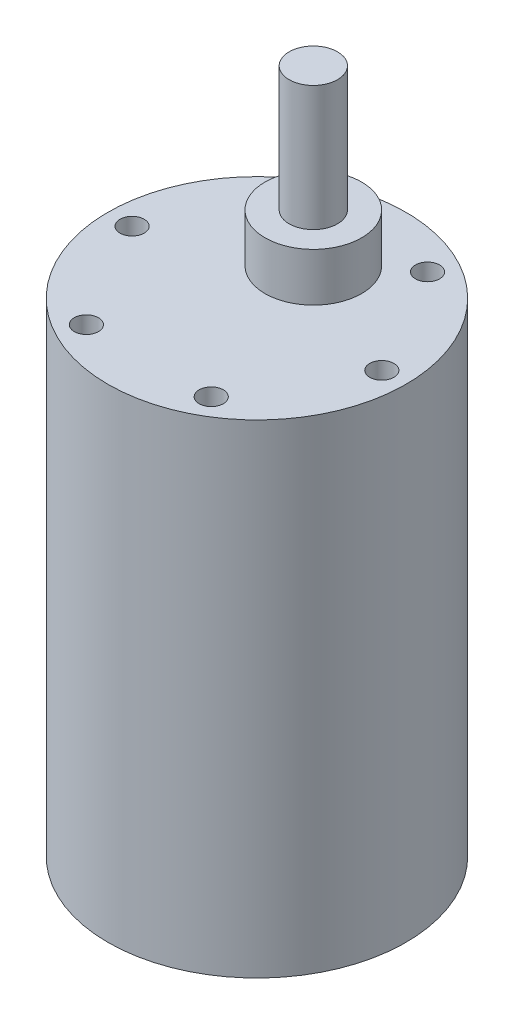
ISO-10303-21;
HEADER;
FILE_DESCRIPTION(('STEP AP214'),'2;1');
FILE_NAME('part.step','',(''),(''),'','','');
FILE_SCHEMA(('AUTOMOTIVE_DESIGN { 1 0 10303 214 1 1 1 1 }'));
ENDSEC;
DATA;
#1=APPLICATION_CONTEXT('core data for automotive mechanical design processes');
#2=APPLICATION_PROTOCOL_DEFINITION('international standard','automotive_design',2000,#1);
#3=PRODUCT_CONTEXT('',#1,'mechanical');
#4=PRODUCT('Part','Part','',(#3));
#5=PRODUCT_RELATED_PRODUCT_CATEGORY('part','',(#4));
#6=PRODUCT_DEFINITION_FORMATION('','',#4);
#7=PRODUCT_DEFINITION_CONTEXT('part definition',#1,'design');
#8=PRODUCT_DEFINITION('design','',#6,#7);
#9=PRODUCT_DEFINITION_SHAPE('','',#8);
#10=(LENGTH_UNIT() NAMED_UNIT(*) SI_UNIT(.MILLI.,.METRE.));
#11=(NAMED_UNIT(*) PLANE_ANGLE_UNIT() SI_UNIT($,.RADIAN.));
#12=(NAMED_UNIT(*) SI_UNIT($,.STERADIAN.) SOLID_ANGLE_UNIT());
#13=UNCERTAINTY_MEASURE_WITH_UNIT(LENGTH_MEASURE(1.E-05),#10,'distance_accuracy_value','');
#14=(GEOMETRIC_REPRESENTATION_CONTEXT(3) GLOBAL_UNCERTAINTY_ASSIGNED_CONTEXT((#13)) GLOBAL_UNIT_ASSIGNED_CONTEXT((#10,
#11,#12)) REPRESENTATION_CONTEXT('',''));
#15=CARTESIAN_POINT('',(0.,0.,0.));
#16=DIRECTION('',(0.,0.,1.));
#17=DIRECTION('',(1.,0.,0.));
#18=AXIS2_PLACEMENT_3D('',#15,#16,#17);
#19=CARTESIAN_POINT('',(0.,66.,-7.));
#20=DIRECTION('',(0.,1.,0.));
#21=DIRECTION('',(0.,0.,1.));
#22=AXIS2_PLACEMENT_3D('',#19,#20,#21);
#23=PLANE('',#22);
#24=CARTESIAN_POINT('',(0.,66.,-7.));
#25=DIRECTION('',(0.,1.,0.));
#26=DIRECTION('',(0.,0.,1.));
#27=AXIS2_PLACEMENT_3D('',#24,#25,#26);
#28=CIRCLE('',#27,6.);
#29=CARTESIAN_POINT('',(0.,66.,-0.999999999999999));
#30=VERTEX_POINT('',#29);
#31=EDGE_CURVE('E44',#30,#30,#28,.T.);
#32=ORIENTED_EDGE('',*,*,#31,.T.);
#33=EDGE_LOOP('',(#32));
#34=FACE_BOUND('',#33,.T.);
#35=CARTESIAN_POINT('',(0.,66.,-7.));
#36=DIRECTION('',(0.,1.,0.));
#37=DIRECTION('',(0.,0.,1.));
#38=AXIS2_PLACEMENT_3D('',#35,#36,#37);
#39=CIRCLE('',#38,3.);
#40=CARTESIAN_POINT('',(0.,66.,-4.));
#41=VERTEX_POINT('',#40);
#42=EDGE_CURVE('E52',#41,#41,#39,.T.);
#43=ORIENTED_EDGE('',*,*,#42,.F.);
#44=EDGE_LOOP('',(#43));
#45=FACE_BOUND('',#44,.T.);
#46=ADVANCED_FACE('F33',(#34,#45),#23,.T.);
#47=CARTESIAN_POINT('',(0.,60.,0.));
#48=DIRECTION('',(0.,1.,0.));
#49=DIRECTION('',(0.,0.,1.));
#50=AXIS2_PLACEMENT_3D('',#47,#48,#49);
#51=PLANE('',#50);
#52=CARTESIAN_POINT('',(7.74999999999987,60.,-13.4233937586589));
#53=DIRECTION('',(0.,1.,0.));
#54=DIRECTION('',(-0.866025403784433,0.,0.50000000000001));
#55=AXIS2_PLACEMENT_3D('',#52,#53,#54);
#56=CIRCLE('',#55,1.5);
#57=CARTESIAN_POINT('',(6.45096189432322,60.,-12.6733937586589));
#58=VERTEX_POINT('',#57);
#59=EDGE_CURVE('E88',#58,#58,#56,.T.);
#60=ORIENTED_EDGE('',*,*,#59,.F.);
#61=EDGE_LOOP('',(#60));
#62=FACE_BOUND('',#61,.T.);
#63=CARTESIAN_POINT('',(15.5,60.,-1.10154940724527E-13));
#64=DIRECTION('',(0.,1.,0.));
#65=DIRECTION('',(-0.866025403784443,0.,-0.499999999999992));
#66=AXIS2_PLACEMENT_3D('',#63,#64,#65);
#67=CIRCLE('',#66,1.5);
#68=CARTESIAN_POINT('',(14.2009618943233,60.,-0.750000000000098));
#69=VERTEX_POINT('',#68);
#70=EDGE_CURVE('E82',#69,#69,#67,.T.);
#71=ORIENTED_EDGE('',*,*,#70,.F.);
#72=EDGE_LOOP('',(#71));
#73=FACE_BOUND('',#72,.T.);
#74=CARTESIAN_POINT('',(7.74999999999997,60.,13.4233937586588));
#75=DIRECTION('',(0.,1.,0.));
#76=DIRECTION('',(0.,0.,-1.));
#77=AXIS2_PLACEMENT_3D('',#74,#75,#76);
#78=CIRCLE('',#77,1.5);
#79=CARTESIAN_POINT('',(7.74999999999997,60.,11.9233937586588));
#80=VERTEX_POINT('',#79);
#81=EDGE_CURVE('E76',#80,#80,#78,.T.);
#82=ORIENTED_EDGE('',*,*,#81,.F.);
#83=EDGE_LOOP('',(#82));
#84=FACE_BOUND('',#83,.T.);
#85=CARTESIAN_POINT('',(-7.74999999999997,60.,13.4233937586588));
#86=DIRECTION('',(0.,1.,0.));
#87=DIRECTION('',(0.866025403784436,0.,-0.500000000000004));
#88=AXIS2_PLACEMENT_3D('',#85,#86,#87);
#89=CIRCLE('',#88,1.5);
#90=CARTESIAN_POINT('',(-6.45096189432331,60.,12.6733937586588));
#91=VERTEX_POINT('',#90);
#92=EDGE_CURVE('E70',#91,#91,#89,.T.);
#93=ORIENTED_EDGE('',*,*,#92,.F.);
#94=EDGE_LOOP('',(#93));
#95=FACE_BOUND('',#94,.T.);
#96=CARTESIAN_POINT('',(-15.5,60.,0.));
#97=DIRECTION('',(0.,1.,0.));
#98=DIRECTION('',(0.86602540378444,0.,0.499999999999998));
#99=AXIS2_PLACEMENT_3D('',#96,#97,#98);
#100=CIRCLE('',#99,1.5);
#101=CARTESIAN_POINT('',(-14.2009618943233,60.,0.749999999999999));
#102=VERTEX_POINT('',#101);
#103=EDGE_CURVE('E64',#102,#102,#100,.T.);
#104=ORIENTED_EDGE('',*,*,#103,.F.);
#105=EDGE_LOOP('',(#104));
#106=FACE_BOUND('',#105,.T.);
#107=CARTESIAN_POINT('',(-7.74999999999997,60.,-13.4233937586588));
#108=DIRECTION('',(0.,1.,0.));
#109=DIRECTION('',(0.,0.,1.));
#110=AXIS2_PLACEMENT_3D('',#107,#108,#109);
#111=CIRCLE('',#110,1.5);
#112=CARTESIAN_POINT('',(-7.74999999999997,60.,-11.9233937586588));
#113=VERTEX_POINT('',#112);
#114=EDGE_CURVE('E58',#113,#113,#111,.T.);
#115=ORIENTED_EDGE('',*,*,#114,.F.);
#116=EDGE_LOOP('',(#115));
#117=FACE_BOUND('',#116,.T.);
#118=CARTESIAN_POINT('',(0.,60.,0.));
#119=DIRECTION('',(0.,1.,0.));
#120=DIRECTION('',(0.,0.,1.));
#121=AXIS2_PLACEMENT_3D('',#118,#119,#120);
#122=CIRCLE('',#121,18.5);
#123=CARTESIAN_POINT('',(0.,60.,18.5));
#124=VERTEX_POINT('',#123);
#125=EDGE_CURVE('E10',#124,#124,#122,.T.);
#126=ORIENTED_EDGE('',*,*,#125,.T.);
#127=EDGE_LOOP('',(#126));
#128=FACE_BOUND('',#127,.T.);
#129=CARTESIAN_POINT('',(0.,60.,-7.));
#130=DIRECTION('',(0.,1.,0.));
#131=DIRECTION('',(0.,0.,1.));
#132=AXIS2_PLACEMENT_3D('',#129,#130,#131);
#133=CIRCLE('',#132,6.);
#134=CARTESIAN_POINT('',(0.,60.,-0.999999999999999));
#135=VERTEX_POINT('',#134);
#136=EDGE_CURVE('E46',#135,#135,#133,.T.);
#137=ORIENTED_EDGE('',*,*,#136,.F.);
#138=EDGE_LOOP('',(#137));
#139=FACE_BOUND('',#138,.T.);
#140=ADVANCED_FACE('F103',(#62,#73,#84,#95,#106,#117,#128,#139),#51,.T.);
#141=CARTESIAN_POINT('',(0.,60.,0.));
#142=DIRECTION('',(0.,-1.,0.));
#143=DIRECTION('',(0.,0.,-1.));
#144=AXIS2_PLACEMENT_3D('',#141,#142,#143);
#145=CYLINDRICAL_SURFACE('',#144,18.5);
#146=ORIENTED_EDGE('',*,*,#125,.F.);
#147=EDGE_LOOP('',(#146));
#148=FACE_BOUND('',#147,.T.);
#149=CARTESIAN_POINT('',(0.,0.,0.));
#150=DIRECTION('',(0.,1.,0.));
#151=DIRECTION('',(0.,0.,1.));
#152=AXIS2_PLACEMENT_3D('',#149,#150,#151);
#153=CIRCLE('',#152,18.5);
#154=CARTESIAN_POINT('',(0.,0.,18.5));
#155=VERTEX_POINT('',#154);
#156=EDGE_CURVE('E37',#155,#155,#153,.T.);
#157=ORIENTED_EDGE('',*,*,#156,.T.);
#158=EDGE_LOOP('',(#157));
#159=FACE_BOUND('',#158,.T.);
#160=ADVANCED_FACE('F35',(#148,#159),#145,.T.);
#161=CARTESIAN_POINT('',(0.,0.,0.));
#162=DIRECTION('',(0.,1.,0.));
#163=DIRECTION('',(0.,0.,1.));
#164=AXIS2_PLACEMENT_3D('',#161,#162,#163);
#165=PLANE('',#164);
#166=ORIENTED_EDGE('',*,*,#156,.F.);
#167=EDGE_LOOP('',(#166));
#168=FACE_BOUND('',#167,.T.);
#169=ADVANCED_FACE('F122',(#168),#165,.F.);
#170=CARTESIAN_POINT('',(0.,66.,-7.));
#171=DIRECTION('',(0.,-1.,0.));
#172=DIRECTION('',(0.,0.,-1.));
#173=AXIS2_PLACEMENT_3D('',#170,#171,#172);
#174=CYLINDRICAL_SURFACE('',#173,6.);
#175=ORIENTED_EDGE('',*,*,#31,.F.);
#176=EDGE_LOOP('',(#175));
#177=FACE_BOUND('',#176,.T.);
#178=ORIENTED_EDGE('',*,*,#136,.T.);
#179=EDGE_LOOP('',(#178));
#180=FACE_BOUND('',#179,.T.);
#181=ADVANCED_FACE('F119',(#177,#180),#174,.T.);
#182=CARTESIAN_POINT('',(0.,81.5,-7.));
#183=DIRECTION('',(0.,-1.,0.));
#184=DIRECTION('',(0.,0.,-1.));
#185=AXIS2_PLACEMENT_3D('',#182,#183,#184);
#186=CYLINDRICAL_SURFACE('',#185,3.);
#187=CARTESIAN_POINT('',(0.,81.5,-7.));
#188=DIRECTION('',(0.,1.,0.));
#189=DIRECTION('',(0.,0.,1.));
#190=AXIS2_PLACEMENT_3D('',#187,#188,#189);
#191=CIRCLE('',#190,3.);
#192=CARTESIAN_POINT('',(0.,81.5,-4.));
#193=VERTEX_POINT('',#192);
#194=EDGE_CURVE('E49',#193,#193,#191,.T.);
#195=ORIENTED_EDGE('',*,*,#194,.F.);
#196=EDGE_LOOP('',(#195));
#197=FACE_BOUND('',#196,.T.);
#198=ORIENTED_EDGE('',*,*,#42,.T.);
#199=EDGE_LOOP('',(#198));
#200=FACE_BOUND('',#199,.T.);
#201=ADVANCED_FACE('F121',(#197,#200),#186,.T.);
#202=CARTESIAN_POINT('',(0.,81.5,-7.));
#203=DIRECTION('',(0.,1.,0.));
#204=DIRECTION('',(0.,0.,1.));
#205=AXIS2_PLACEMENT_3D('',#202,#203,#204);
#206=PLANE('',#205);
#207=ORIENTED_EDGE('',*,*,#194,.T.);
#208=EDGE_LOOP('',(#207));
#209=FACE_BOUND('',#208,.T.);
#210=ADVANCED_FACE('F129',(#209),#206,.T.);
#211=CARTESIAN_POINT('',(-7.74999999999997,55.,-13.4233937586588));
#212=DIRECTION('',(0.,1.,0.));
#213=DIRECTION('',(0.,0.,1.));
#214=AXIS2_PLACEMENT_3D('',#211,#212,#213);
#215=CYLINDRICAL_SURFACE('',#214,1.5);
#216=CARTESIAN_POINT('',(-7.74999999999997,55.,-13.4233937586588));
#217=DIRECTION('',(0.,1.,0.));
#218=DIRECTION('',(0.,0.,1.));
#219=AXIS2_PLACEMENT_3D('',#216,#217,#218);
#220=CIRCLE('',#219,1.5);
#221=CARTESIAN_POINT('',(-7.74999999999997,55.,-11.9233937586588));
#222=VERTEX_POINT('',#221);
#223=EDGE_CURVE('E55',#222,#222,#220,.T.);
#224=ORIENTED_EDGE('',*,*,#223,.F.);
#225=EDGE_LOOP('',(#224));
#226=FACE_BOUND('',#225,.T.);
#227=ORIENTED_EDGE('',*,*,#114,.T.);
#228=EDGE_LOOP('',(#227));
#229=FACE_BOUND('',#228,.T.);
#230=ADVANCED_FACE('F143',(#226,#229),#215,.F.);
#231=CARTESIAN_POINT('',(-7.74999999999997,55.,-13.4233937586588));
#232=DIRECTION('',(0.,1.,0.));
#233=DIRECTION('',(0.,0.,1.));
#234=AXIS2_PLACEMENT_3D('',#231,#232,#233);
#235=PLANE('',#234);
#236=ORIENTED_EDGE('',*,*,#223,.T.);
#237=EDGE_LOOP('',(#236));
#238=FACE_BOUND('',#237,.T.);
#239=ADVANCED_FACE('F147',(#238),#235,.T.);
#240=CARTESIAN_POINT('',(-15.5,55.,0.));
#241=DIRECTION('',(0.,1.,0.));
#242=DIRECTION('',(0.,0.,1.));
#243=AXIS2_PLACEMENT_3D('',#240,#241,#242);
#244=CYLINDRICAL_SURFACE('',#243,1.5);
#245=CARTESIAN_POINT('',(-15.5,55.,0.));
#246=DIRECTION('',(0.,1.,0.));
#247=DIRECTION('',(0.86602540378444,0.,0.499999999999998));
#248=AXIS2_PLACEMENT_3D('',#245,#246,#247);
#249=CIRCLE('',#248,1.5);
#250=CARTESIAN_POINT('',(-14.2009618943233,55.,0.749999999999999));
#251=VERTEX_POINT('',#250);
#252=EDGE_CURVE('E61',#251,#251,#249,.T.);
#253=ORIENTED_EDGE('',*,*,#252,.F.);
#254=EDGE_LOOP('',(#253));
#255=FACE_BOUND('',#254,.T.);
#256=ORIENTED_EDGE('',*,*,#103,.T.);
#257=EDGE_LOOP('',(#256));
#258=FACE_BOUND('',#257,.T.);
#259=ADVANCED_FACE('F151',(#255,#258),#244,.F.);
#260=CARTESIAN_POINT('',(-15.5,55.,0.));
#261=DIRECTION('',(0.,1.,0.));
#262=DIRECTION('',(0.86602540378444,0.,0.499999999999998));
#263=AXIS2_PLACEMENT_3D('',#260,#261,#262);
#264=PLANE('',#263);
#265=ORIENTED_EDGE('',*,*,#252,.T.);
#266=EDGE_LOOP('',(#265));
#267=FACE_BOUND('',#266,.T.);
#268=ADVANCED_FACE('F155',(#267),#264,.T.);
#269=CARTESIAN_POINT('',(-7.74999999999997,55.,13.4233937586588));
#270=DIRECTION('',(0.,1.,0.));
#271=DIRECTION('',(0.,0.,1.));
#272=AXIS2_PLACEMENT_3D('',#269,#270,#271);
#273=CYLINDRICAL_SURFACE('',#272,1.5);
#274=CARTESIAN_POINT('',(-7.74999999999997,55.,13.4233937586588));
#275=DIRECTION('',(0.,1.,0.));
#276=DIRECTION('',(0.866025403784436,0.,-0.500000000000004));
#277=AXIS2_PLACEMENT_3D('',#274,#275,#276);
#278=CIRCLE('',#277,1.5);
#279=CARTESIAN_POINT('',(-6.45096189432331,55.,12.6733937586588));
#280=VERTEX_POINT('',#279);
#281=EDGE_CURVE('E67',#280,#280,#278,.T.);
#282=ORIENTED_EDGE('',*,*,#281,.F.);
#283=EDGE_LOOP('',(#282));
#284=FACE_BOUND('',#283,.T.);
#285=ORIENTED_EDGE('',*,*,#92,.T.);
#286=EDGE_LOOP('',(#285));
#287=FACE_BOUND('',#286,.T.);
#288=ADVANCED_FACE('F159',(#284,#287),#273,.F.);
#289=CARTESIAN_POINT('',(-7.74999999999997,55.,13.4233937586588));
#290=DIRECTION('',(0.,1.,0.));
#291=DIRECTION('',(0.866025403784436,0.,-0.500000000000004));
#292=AXIS2_PLACEMENT_3D('',#289,#290,#291);
#293=PLANE('',#292);
#294=ORIENTED_EDGE('',*,*,#281,.T.);
#295=EDGE_LOOP('',(#294));
#296=FACE_BOUND('',#295,.T.);
#297=ADVANCED_FACE('F163',(#296),#293,.T.);
#298=CARTESIAN_POINT('',(7.74999999999997,55.,13.4233937586588));
#299=DIRECTION('',(0.,1.,0.));
#300=DIRECTION('',(0.,0.,1.));
#301=AXIS2_PLACEMENT_3D('',#298,#299,#300);
#302=CYLINDRICAL_SURFACE('',#301,1.5);
#303=CARTESIAN_POINT('',(7.74999999999997,55.,13.4233937586588));
#304=DIRECTION('',(0.,1.,0.));
#305=DIRECTION('',(0.,0.,-1.));
#306=AXIS2_PLACEMENT_3D('',#303,#304,#305);
#307=CIRCLE('',#306,1.5);
#308=CARTESIAN_POINT('',(7.74999999999997,55.,11.9233937586588));
#309=VERTEX_POINT('',#308);
#310=EDGE_CURVE('E73',#309,#309,#307,.T.);
#311=ORIENTED_EDGE('',*,*,#310,.F.);
#312=EDGE_LOOP('',(#311));
#313=FACE_BOUND('',#312,.T.);
#314=ORIENTED_EDGE('',*,*,#81,.T.);
#315=EDGE_LOOP('',(#314));
#316=FACE_BOUND('',#315,.T.);
#317=ADVANCED_FACE('F167',(#313,#316),#302,.F.);
#318=CARTESIAN_POINT('',(7.74999999999997,55.,13.4233937586588));
#319=DIRECTION('',(0.,1.,0.));
#320=DIRECTION('',(0.,0.,-1.));
#321=AXIS2_PLACEMENT_3D('',#318,#319,#320);
#322=PLANE('',#321);
#323=ORIENTED_EDGE('',*,*,#310,.T.);
#324=EDGE_LOOP('',(#323));
#325=FACE_BOUND('',#324,.T.);
#326=ADVANCED_FACE('F171',(#325),#322,.T.);
#327=CARTESIAN_POINT('',(15.5,55.,-1.10154940724527E-13));
#328=DIRECTION('',(0.,1.,0.));
#329=DIRECTION('',(0.,0.,1.));
#330=AXIS2_PLACEMENT_3D('',#327,#328,#329);
#331=CYLINDRICAL_SURFACE('',#330,1.5);
#332=CARTESIAN_POINT('',(15.5,55.,-1.10154940724527E-13));
#333=DIRECTION('',(0.,1.,0.));
#334=DIRECTION('',(-0.866025403784443,0.,-0.499999999999992));
#335=AXIS2_PLACEMENT_3D('',#332,#333,#334);
#336=CIRCLE('',#335,1.5);
#337=CARTESIAN_POINT('',(14.2009618943233,55.,-0.750000000000098));
#338=VERTEX_POINT('',#337);
#339=EDGE_CURVE('E79',#338,#338,#336,.T.);
#340=ORIENTED_EDGE('',*,*,#339,.F.);
#341=EDGE_LOOP('',(#340));
#342=FACE_BOUND('',#341,.T.);
#343=ORIENTED_EDGE('',*,*,#70,.T.);
#344=EDGE_LOOP('',(#343));
#345=FACE_BOUND('',#344,.T.);
#346=ADVANCED_FACE('F175',(#342,#345),#331,.F.);
#347=CARTESIAN_POINT('',(15.5,55.,-1.10154940724527E-13));
#348=DIRECTION('',(0.,1.,0.));
#349=DIRECTION('',(-0.866025403784443,0.,-0.499999999999992));
#350=AXIS2_PLACEMENT_3D('',#347,#348,#349);
#351=PLANE('',#350);
#352=ORIENTED_EDGE('',*,*,#339,.T.);
#353=EDGE_LOOP('',(#352));
#354=FACE_BOUND('',#353,.T.);
#355=ADVANCED_FACE('F99',(#354),#351,.T.);
#356=CARTESIAN_POINT('',(7.74999999999987,55.,-13.4233937586589));
#357=DIRECTION('',(0.,1.,0.));
#358=DIRECTION('',(0.,0.,1.));
#359=AXIS2_PLACEMENT_3D('',#356,#357,#358);
#360=CYLINDRICAL_SURFACE('',#359,1.5);
#361=CARTESIAN_POINT('',(7.74999999999987,55.,-13.4233937586589));
#362=DIRECTION('',(0.,1.,0.));
#363=DIRECTION('',(-0.866025403784433,0.,0.50000000000001));
#364=AXIS2_PLACEMENT_3D('',#361,#362,#363);
#365=CIRCLE('',#364,1.5);
#366=CARTESIAN_POINT('',(6.45096189432322,55.,-12.6733937586589));
#367=VERTEX_POINT('',#366);
#368=EDGE_CURVE('E85',#367,#367,#365,.T.);
#369=ORIENTED_EDGE('',*,*,#368,.F.);
#370=EDGE_LOOP('',(#369));
#371=FACE_BOUND('',#370,.T.);
#372=ORIENTED_EDGE('',*,*,#59,.T.);
#373=EDGE_LOOP('',(#372));
#374=FACE_BOUND('',#373,.T.);
#375=ADVANCED_FACE('F96',(#371,#374),#360,.F.);
#376=CARTESIAN_POINT('',(7.74999999999987,55.,-13.4233937586589));
#377=DIRECTION('',(0.,1.,0.));
#378=DIRECTION('',(-0.866025403784433,0.,0.50000000000001));
#379=AXIS2_PLACEMENT_3D('',#376,#377,#378);
#380=PLANE('',#379);
#381=ORIENTED_EDGE('',*,*,#368,.T.);
#382=EDGE_LOOP('',(#381));
#383=FACE_BOUND('',#382,.T.);
#384=ADVANCED_FACE('F94',(#383),#380,.T.);
#385=CLOSED_SHELL('',(#46,#140,#160,#169,#181,#201,#210,#230,#239,#259,#268,#288,#297,#317,#326,
#346,#355,#375,#384));
#386=MANIFOLD_SOLID_BREP('B2',#385);
#387=ADVANCED_BREP_SHAPE_REPRESENTATION('',(#18,#386),#14);
#388=SHAPE_DEFINITION_REPRESENTATION(#9,#387);
ENDSEC;
END-ISO-10303-21;
